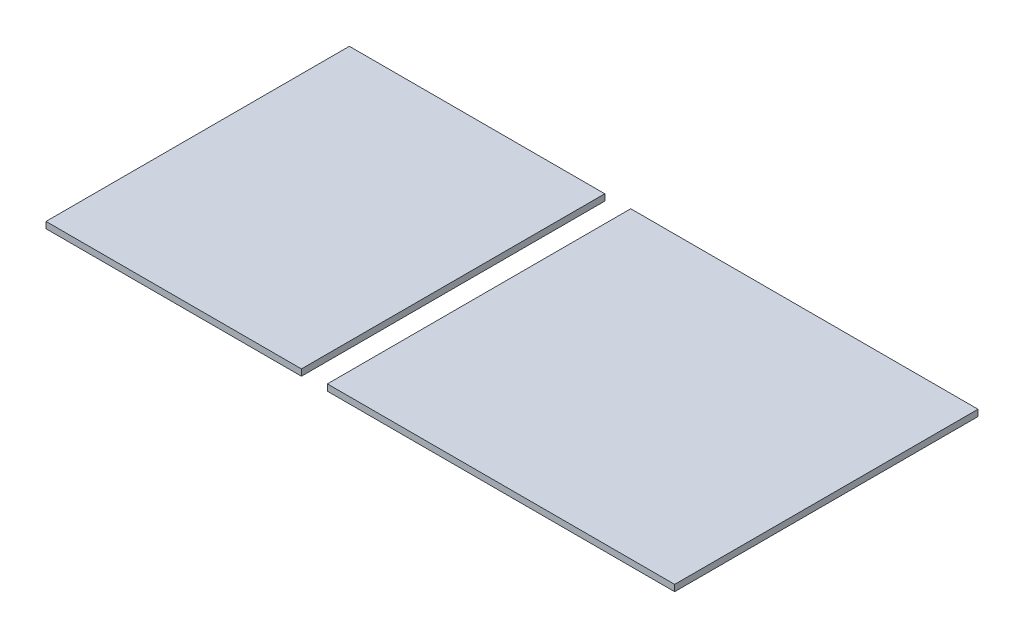
ISO-10303-21;
HEADER;
FILE_DESCRIPTION(('STEP AP214'),'2;1');
FILE_NAME('part.step','',(''),(''),'','','');
FILE_SCHEMA(('AUTOMOTIVE_DESIGN { 1 0 10303 214 1 1 1 1 }'));
ENDSEC;
DATA;
#1=APPLICATION_CONTEXT('core data for automotive mechanical design processes');
#2=APPLICATION_PROTOCOL_DEFINITION('international standard','automotive_design',2000,#1);
#3=PRODUCT_CONTEXT('',#1,'mechanical');
#4=PRODUCT('Part','Part','',(#3));
#5=PRODUCT_RELATED_PRODUCT_CATEGORY('part','',(#4));
#6=PRODUCT_DEFINITION_FORMATION('','',#4);
#7=PRODUCT_DEFINITION_CONTEXT('part definition',#1,'design');
#8=PRODUCT_DEFINITION('design','',#6,#7);
#9=PRODUCT_DEFINITION_SHAPE('','',#8);
#10=(LENGTH_UNIT() NAMED_UNIT(*) SI_UNIT(.MILLI.,.METRE.));
#11=(NAMED_UNIT(*) PLANE_ANGLE_UNIT() SI_UNIT($,.RADIAN.));
#12=(NAMED_UNIT(*) SI_UNIT($,.STERADIAN.) SOLID_ANGLE_UNIT());
#13=UNCERTAINTY_MEASURE_WITH_UNIT(LENGTH_MEASURE(1.E-05),#10,'distance_accuracy_value','');
#14=(GEOMETRIC_REPRESENTATION_CONTEXT(3) GLOBAL_UNCERTAINTY_ASSIGNED_CONTEXT((#13)) GLOBAL_UNIT_ASSIGNED_CONTEXT((#10,
#11,#12)) REPRESENTATION_CONTEXT('',''));
#15=CARTESIAN_POINT('',(0.,0.,0.));
#16=DIRECTION('',(0.,0.,1.));
#17=DIRECTION('',(1.,0.,0.));
#18=AXIS2_PLACEMENT_3D('',#15,#16,#17);
#19=CARTESIAN_POINT('',(-2890.72362382102,2994.95800744211,-812.481714062833));
#20=DIRECTION('',(1.,0.,0.));
#21=DIRECTION('',(0.,-1.,0.));
#22=AXIS2_PLACEMENT_3D('',#19,#20,#21);
#23=PLANE('',#22);
#24=DIRECTION('',(0.,0.,1.));
#25=VECTOR('',#24,1.);
#26=CARTESIAN_POINT('',(-2890.72362382102,60.7357595542654,-812.481714062833));
#27=LINE('',#26,#25);
#28=CARTESIAN_POINT('',(-2890.72362382102,60.7357595542654,-812.481714062833));
#29=VERTEX_POINT('',#28);
#30=CARTESIAN_POINT('',(-2890.72362382102,60.7357595542654,1117.91828593717));
#31=VERTEX_POINT('',#30);
#32=EDGE_CURVE('P0_E66',#29,#31,#27,.T.);
#33=ORIENTED_EDGE('',*,*,#32,.F.);
#34=DIRECTION('',(0.,-1.,0.));
#35=VECTOR('',#34,1.);
#36=CARTESIAN_POINT('',(-2890.72362382102,2994.95800744211,-812.481714062833));
#37=LINE('',#36,#35);
#38=CARTESIAN_POINT('',(-2890.72362382102,20.0957595542656,-812.481714062833));
#39=VERTEX_POINT('',#38);
#40=EDGE_CURVE('P0_E20',#29,#39,#37,.T.);
#41=ORIENTED_EDGE('',*,*,#40,.T.);
#42=DIRECTION('',(0.,0.,1.));
#43=VECTOR('',#42,1.);
#44=CARTESIAN_POINT('',(-2890.72362382102,20.0957595542656,-812.481714062833));
#45=LINE('',#44,#43);
#46=CARTESIAN_POINT('',(-2890.72362382102,20.0957595542656,1117.91828593717));
#47=VERTEX_POINT('',#46);
#48=EDGE_CURVE('P0_E64',#39,#47,#45,.T.);
#49=ORIENTED_EDGE('',*,*,#48,.T.);
#50=DIRECTION('',(0.,-1.,0.));
#51=VECTOR('',#50,1.);
#52=CARTESIAN_POINT('',(-2890.72362382102,2994.95800744211,1117.91828593717));
#53=LINE('',#52,#51);
#54=EDGE_CURVE('P0_E55',#31,#47,#53,.T.);
#55=ORIENTED_EDGE('',*,*,#54,.F.);
#56=EDGE_LOOP('',(#33,#41,#49,#55));
#57=FACE_BOUND('',#56,.T.);
#58=ADVANCED_FACE('P0_F16',(#57),#23,.F.);
#59=CARTESIAN_POINT('',(-2890.72362382102,2994.95800744211,1117.91828593717));
#60=DIRECTION('',(0.,0.,-1.));
#61=DIRECTION('',(-1.,0.,0.));
#62=AXIS2_PLACEMENT_3D('',#59,#60,#61);
#63=PLANE('',#62);
#64=DIRECTION('',(1.,0.,0.));
#65=VECTOR('',#64,1.);
#66=CARTESIAN_POINT('',(-2890.72362382102,60.7357595542654,1117.91828593717));
#67=LINE('',#66,#65);
#68=CARTESIAN_POINT('',(-1265.12362382102,60.7357595542654,1117.91828593717));
#69=VERTEX_POINT('',#68);
#70=EDGE_CURVE('P0_E25',#31,#69,#67,.T.);
#71=ORIENTED_EDGE('',*,*,#70,.F.);
#72=ORIENTED_EDGE('',*,*,#54,.T.);
#73=DIRECTION('',(1.,0.,0.));
#74=VECTOR('',#73,1.);
#75=CARTESIAN_POINT('',(-2890.72362382102,20.0957595542656,1117.91828593717));
#76=LINE('',#75,#74);
#77=CARTESIAN_POINT('',(-1265.12362382102,20.0957595542656,1117.91828593717));
#78=VERTEX_POINT('',#77);
#79=EDGE_CURVE('P0_E76',#47,#78,#76,.T.);
#80=ORIENTED_EDGE('',*,*,#79,.T.);
#81=DIRECTION('',(0.,-1.,0.));
#82=VECTOR('',#81,1.);
#83=CARTESIAN_POINT('',(-1265.12362382102,2994.95800744211,1117.91828593717));
#84=LINE('',#83,#82);
#85=EDGE_CURVE('P0_E85',#69,#78,#84,.T.);
#86=ORIENTED_EDGE('',*,*,#85,.F.);
#87=EDGE_LOOP('',(#71,#72,#80,#86));
#88=FACE_BOUND('',#87,.T.);
#89=ADVANCED_FACE('P0_F89',(#88),#63,.F.);
#90=CARTESIAN_POINT('',(-1265.12362382102,2994.95800744211,1117.91828593717));
#91=DIRECTION('',(-1.,0.,0.));
#92=DIRECTION('',(0.,0.,1.));
#93=AXIS2_PLACEMENT_3D('',#90,#91,#92);
#94=PLANE('',#93);
#95=DIRECTION('',(0.,0.,-1.));
#96=VECTOR('',#95,1.);
#97=CARTESIAN_POINT('',(-1265.12362382102,60.7357595542654,1117.91828593717));
#98=LINE('',#97,#96);
#99=CARTESIAN_POINT('',(-1265.12362382102,60.7357595542654,-812.481714062833));
#100=VERTEX_POINT('',#99);
#101=EDGE_CURVE('P0_E10',#69,#100,#98,.T.);
#102=ORIENTED_EDGE('',*,*,#101,.F.);
#103=ORIENTED_EDGE('',*,*,#85,.T.);
#104=DIRECTION('',(0.,0.,-1.));
#105=VECTOR('',#104,1.);
#106=CARTESIAN_POINT('',(-1265.12362382102,20.0957595542656,1117.91828593717));
#107=LINE('',#106,#105);
#108=CARTESIAN_POINT('',(-1265.12362382102,20.0957595542656,-812.481714062833));
#109=VERTEX_POINT('',#108);
#110=EDGE_CURVE('P0_E86',#78,#109,#107,.T.);
#111=ORIENTED_EDGE('',*,*,#110,.T.);
#112=DIRECTION('',(0.,-1.,0.));
#113=VECTOR('',#112,1.);
#114=CARTESIAN_POINT('',(-1265.12362382102,2994.95800744211,-812.481714062833));
#115=LINE('',#114,#113);
#116=EDGE_CURVE('P0_E38',#100,#109,#115,.T.);
#117=ORIENTED_EDGE('',*,*,#116,.F.);
#118=EDGE_LOOP('',(#102,#103,#111,#117));
#119=FACE_BOUND('',#118,.T.);
#120=ADVANCED_FACE('P0_F88',(#119),#94,.F.);
#121=CARTESIAN_POINT('',(-1265.12362382102,2994.95800744211,-812.481714062833));
#122=DIRECTION('',(0.,0.,1.));
#123=DIRECTION('',(0.,-1.,0.));
#124=AXIS2_PLACEMENT_3D('',#121,#122,#123);
#125=PLANE('',#124);
#126=DIRECTION('',(-1.,0.,0.));
#127=VECTOR('',#126,1.);
#128=CARTESIAN_POINT('',(-1265.12362382102,60.7357595542654,-812.481714062833));
#129=LINE('',#128,#127);
#130=EDGE_CURVE('P0_E73',#100,#29,#129,.T.);
#131=ORIENTED_EDGE('',*,*,#130,.F.);
#132=ORIENTED_EDGE('',*,*,#116,.T.);
#133=DIRECTION('',(-1.,0.,0.));
#134=VECTOR('',#133,1.);
#135=CARTESIAN_POINT('',(-1265.12362382102,20.0957595542656,-812.481714062833));
#136=LINE('',#135,#134);
#137=EDGE_CURVE('P0_E69',#109,#39,#136,.T.);
#138=ORIENTED_EDGE('',*,*,#137,.T.);
#139=ORIENTED_EDGE('',*,*,#40,.F.);
#140=EDGE_LOOP('',(#131,#132,#138,#139));
#141=FACE_BOUND('',#140,.T.);
#142=ADVANCED_FACE('P0_F70',(#141),#125,.F.);
#143=CARTESIAN_POINT('',(-2954.22362382102,20.0957595542656,1181.41828593717));
#144=DIRECTION('',(0.,1.,0.));
#145=DIRECTION('',(1.,0.,0.));
#146=AXIS2_PLACEMENT_3D('',#143,#144,#145);
#147=PLANE('',#146);
#148=ORIENTED_EDGE('',*,*,#48,.F.);
#149=ORIENTED_EDGE('',*,*,#137,.F.);
#150=ORIENTED_EDGE('',*,*,#110,.F.);
#151=ORIENTED_EDGE('',*,*,#79,.F.);
#152=EDGE_LOOP('',(#148,#149,#150,#151));
#153=FACE_BOUND('',#152,.T.);
#154=ADVANCED_FACE('P0_F75',(#153),#147,.F.);
#155=CARTESIAN_POINT('',(-2954.22362382102,60.7357595542656,1181.41828593717));
#156=DIRECTION('',(0.,1.,0.));
#157=DIRECTION('',(1.,0.,0.));
#158=AXIS2_PLACEMENT_3D('',#155,#156,#157);
#159=PLANE('',#158);
#160=ORIENTED_EDGE('',*,*,#130,.T.);
#161=ORIENTED_EDGE('',*,*,#32,.T.);
#162=ORIENTED_EDGE('',*,*,#70,.T.);
#163=ORIENTED_EDGE('',*,*,#101,.T.);
#164=EDGE_LOOP('',(#160,#161,#162,#163));
#165=FACE_BOUND('',#164,.T.);
#166=ADVANCED_FACE('P0_F18',(#165),#159,.T.);
#167=CLOSED_SHELL('',(#58,#89,#120,#142,#154,#166));
#168=MANIFOLD_SOLID_BREP('P0_B1',#167);
#169=CARTESIAN_POINT('',(-1100.02362382102,2994.95800744211,-812.481714062833));
#170=DIRECTION('',(1.,0.,0.));
#171=DIRECTION('',(0.,-1.,0.));
#172=AXIS2_PLACEMENT_3D('',#169,#170,#171);
#173=PLANE('',#172);
#174=DIRECTION('',(0.,0.,1.));
#175=VECTOR('',#174,1.);
#176=CARTESIAN_POINT('',(-1100.02362382102,60.7357595542654,-812.481714062833));
#177=LINE('',#176,#175);
#178=CARTESIAN_POINT('',(-1100.02362382102,60.7357595542654,-812.481714062833));
#179=VERTEX_POINT('',#178);
#180=CARTESIAN_POINT('',(-1100.02362382102,60.7357595542654,1117.91828593717));
#181=VERTEX_POINT('',#180);
#182=EDGE_CURVE('P1_E67',#179,#181,#177,.T.);
#183=ORIENTED_EDGE('',*,*,#182,.F.);
#184=DIRECTION('',(0.,-1.,0.));
#185=VECTOR('',#184,1.);
#186=CARTESIAN_POINT('',(-1100.02362382102,2994.95800744211,-812.481714062833));
#187=LINE('',#186,#185);
#188=CARTESIAN_POINT('',(-1100.02362382102,20.0957595542656,-812.481714062833));
#189=VERTEX_POINT('',#188);
#190=EDGE_CURVE('P1_E21',#179,#189,#187,.T.);
#191=ORIENTED_EDGE('',*,*,#190,.T.);
#192=DIRECTION('',(0.,0.,1.));
#193=VECTOR('',#192,1.);
#194=CARTESIAN_POINT('',(-1100.02362382102,20.0957595542656,-812.481714062833));
#195=LINE('',#194,#193);
#196=CARTESIAN_POINT('',(-1100.02362382102,20.0957595542656,1117.91828593717));
#197=VERTEX_POINT('',#196);
#198=EDGE_CURVE('P1_E65',#189,#197,#195,.T.);
#199=ORIENTED_EDGE('',*,*,#198,.T.);
#200=DIRECTION('',(0.,-1.,0.));
#201=VECTOR('',#200,1.);
#202=CARTESIAN_POINT('',(-1100.02362382102,2994.95800744211,1117.91828593717));
#203=LINE('',#202,#201);
#204=EDGE_CURVE('P1_E56',#181,#197,#203,.T.);
#205=ORIENTED_EDGE('',*,*,#204,.F.);
#206=EDGE_LOOP('',(#183,#191,#199,#205));
#207=FACE_BOUND('',#206,.T.);
#208=ADVANCED_FACE('P1_F17',(#207),#173,.F.);
#209=CARTESIAN_POINT('',(-1100.02362382102,2994.95800744211,1117.91828593717));
#210=DIRECTION('',(0.,0.,-1.));
#211=DIRECTION('',(0.,1.,0.));
#212=AXIS2_PLACEMENT_3D('',#209,#210,#211);
#213=PLANE('',#212);
#214=DIRECTION('',(1.,0.,0.));
#215=VECTOR('',#214,1.);
#216=CARTESIAN_POINT('',(-1100.02362382102,60.7357595542654,1117.91828593717));
#217=LINE('',#216,#215);
#218=CARTESIAN_POINT('',(1109.77637617898,60.7357595542654,1117.91828593717));
#219=VERTEX_POINT('',#218);
#220=EDGE_CURVE('P1_E26',#181,#219,#217,.T.);
#221=ORIENTED_EDGE('',*,*,#220,.F.);
#222=ORIENTED_EDGE('',*,*,#204,.T.);
#223=DIRECTION('',(1.,0.,0.));
#224=VECTOR('',#223,1.);
#225=CARTESIAN_POINT('',(-1100.02362382102,20.0957595542656,1117.91828593717));
#226=LINE('',#225,#224);
#227=CARTESIAN_POINT('',(1109.77637617898,20.0957595542656,1117.91828593717));
#228=VERTEX_POINT('',#227);
#229=EDGE_CURVE('P1_E77',#197,#228,#226,.T.);
#230=ORIENTED_EDGE('',*,*,#229,.T.);
#231=DIRECTION('',(0.,-1.,0.));
#232=VECTOR('',#231,1.);
#233=CARTESIAN_POINT('',(1109.77637617898,2994.95800744211,1117.91828593717));
#234=LINE('',#233,#232);
#235=EDGE_CURVE('P1_E86',#219,#228,#234,.T.);
#236=ORIENTED_EDGE('',*,*,#235,.F.);
#237=EDGE_LOOP('',(#221,#222,#230,#236));
#238=FACE_BOUND('',#237,.T.);
#239=ADVANCED_FACE('P1_F90',(#238),#213,.F.);
#240=CARTESIAN_POINT('',(1109.77637617898,2994.95800744211,1117.91828593717));
#241=DIRECTION('',(-1.,0.,0.));
#242=DIRECTION('',(0.,0.,1.));
#243=AXIS2_PLACEMENT_3D('',#240,#241,#242);
#244=PLANE('',#243);
#245=DIRECTION('',(0.,0.,-1.));
#246=VECTOR('',#245,1.);
#247=CARTESIAN_POINT('',(1109.77637617898,60.7357595542654,1117.91828593717));
#248=LINE('',#247,#246);
#249=CARTESIAN_POINT('',(1109.77637617898,60.7357595542654,-812.481714062833));
#250=VERTEX_POINT('',#249);
#251=EDGE_CURVE('P1_E11',#219,#250,#248,.T.);
#252=ORIENTED_EDGE('',*,*,#251,.F.);
#253=ORIENTED_EDGE('',*,*,#235,.T.);
#254=DIRECTION('',(0.,0.,-1.));
#255=VECTOR('',#254,1.);
#256=CARTESIAN_POINT('',(1109.77637617898,20.0957595542656,1117.91828593717));
#257=LINE('',#256,#255);
#258=CARTESIAN_POINT('',(1109.77637617898,20.0957595542656,-812.481714062833));
#259=VERTEX_POINT('',#258);
#260=EDGE_CURVE('P1_E87',#228,#259,#257,.T.);
#261=ORIENTED_EDGE('',*,*,#260,.T.);
#262=DIRECTION('',(0.,-1.,0.));
#263=VECTOR('',#262,1.);
#264=CARTESIAN_POINT('',(1109.77637617898,2994.95800744211,-812.481714062833));
#265=LINE('',#264,#263);
#266=EDGE_CURVE('P1_E39',#250,#259,#265,.T.);
#267=ORIENTED_EDGE('',*,*,#266,.F.);
#268=EDGE_LOOP('',(#252,#253,#261,#267));
#269=FACE_BOUND('',#268,.T.);
#270=ADVANCED_FACE('P1_F89',(#269),#244,.F.);
#271=CARTESIAN_POINT('',(1109.77637617898,2994.95800744211,-812.481714062833));
#272=DIRECTION('',(0.,0.,1.));
#273=DIRECTION('',(0.,-1.,0.));
#274=AXIS2_PLACEMENT_3D('',#271,#272,#273);
#275=PLANE('',#274);
#276=DIRECTION('',(-1.,0.,0.));
#277=VECTOR('',#276,1.);
#278=CARTESIAN_POINT('',(1109.77637617898,60.7357595542654,-812.481714062833));
#279=LINE('',#278,#277);
#280=EDGE_CURVE('P1_E74',#250,#179,#279,.T.);
#281=ORIENTED_EDGE('',*,*,#280,.F.);
#282=ORIENTED_EDGE('',*,*,#266,.T.);
#283=DIRECTION('',(-1.,0.,0.));
#284=VECTOR('',#283,1.);
#285=CARTESIAN_POINT('',(1109.77637617898,20.0957595542656,-812.481714062833));
#286=LINE('',#285,#284);
#287=EDGE_CURVE('P1_E70',#259,#189,#286,.T.);
#288=ORIENTED_EDGE('',*,*,#287,.T.);
#289=ORIENTED_EDGE('',*,*,#190,.F.);
#290=EDGE_LOOP('',(#281,#282,#288,#289));
#291=FACE_BOUND('',#290,.T.);
#292=ADVANCED_FACE('P1_F71',(#291),#275,.F.);
#293=CARTESIAN_POINT('',(-2954.22362382102,20.0957595542656,1181.41828593717));
#294=DIRECTION('',(0.,1.,0.));
#295=DIRECTION('',(1.,0.,0.));
#296=AXIS2_PLACEMENT_3D('',#293,#294,#295);
#297=PLANE('',#296);
#298=ORIENTED_EDGE('',*,*,#198,.F.);
#299=ORIENTED_EDGE('',*,*,#287,.F.);
#300=ORIENTED_EDGE('',*,*,#260,.F.);
#301=ORIENTED_EDGE('',*,*,#229,.F.);
#302=EDGE_LOOP('',(#298,#299,#300,#301));
#303=FACE_BOUND('',#302,.T.);
#304=ADVANCED_FACE('P1_F76',(#303),#297,.F.);
#305=CARTESIAN_POINT('',(-2954.22362382102,60.7357595542656,1181.41828593717));
#306=DIRECTION('',(0.,1.,0.));
#307=DIRECTION('',(1.,0.,0.));
#308=AXIS2_PLACEMENT_3D('',#305,#306,#307);
#309=PLANE('',#308);
#310=ORIENTED_EDGE('',*,*,#280,.T.);
#311=ORIENTED_EDGE('',*,*,#182,.T.);
#312=ORIENTED_EDGE('',*,*,#220,.T.);
#313=ORIENTED_EDGE('',*,*,#251,.T.);
#314=EDGE_LOOP('',(#310,#311,#312,#313));
#315=FACE_BOUND('',#314,.T.);
#316=ADVANCED_FACE('P1_F19',(#315),#309,.T.);
#317=CLOSED_SHELL('',(#208,#239,#270,#292,#304,#316));
#318=MANIFOLD_SOLID_BREP('P1_B1',#317);
#319=ADVANCED_BREP_SHAPE_REPRESENTATION('',(#18,#168,#318),#14);
#320=SHAPE_DEFINITION_REPRESENTATION(#9,#319);
ENDSEC;
END-ISO-10303-21;
